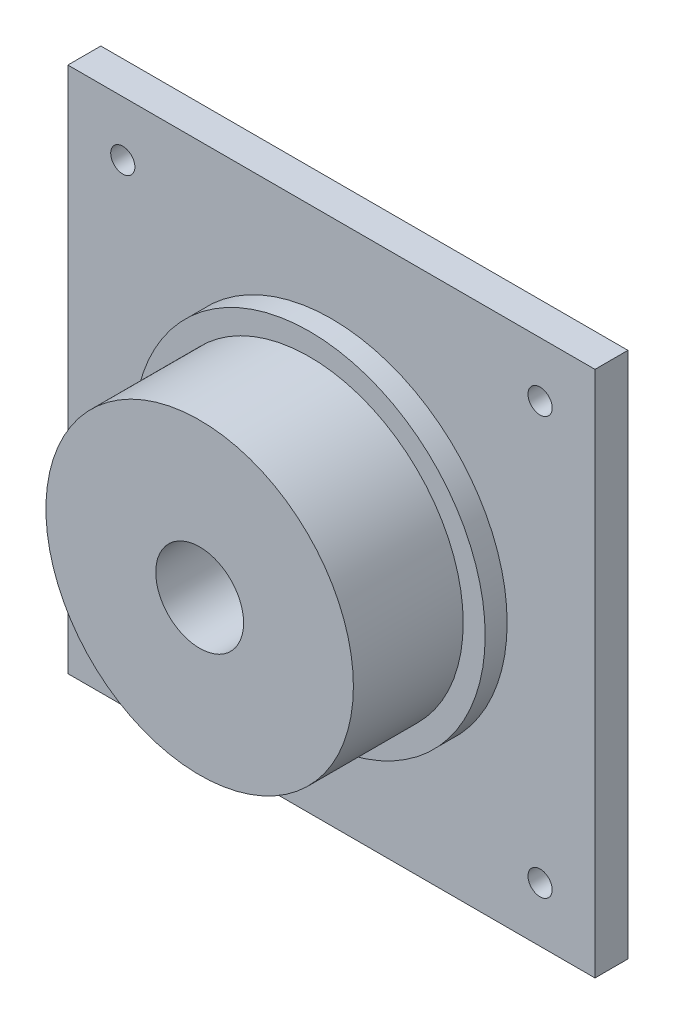
ISO-10303-21;
HEADER;
FILE_DESCRIPTION(('STEP AP214'),'2;1');
FILE_NAME('part.step','',(''),(''),'','','');
FILE_SCHEMA(('AUTOMOTIVE_DESIGN { 1 0 10303 214 1 1 1 1 }'));
ENDSEC;
DATA;
#1=APPLICATION_CONTEXT('core data for automotive mechanical design processes');
#2=APPLICATION_PROTOCOL_DEFINITION('international standard','automotive_design',2000,#1);
#3=PRODUCT_CONTEXT('',#1,'mechanical');
#4=PRODUCT('Part','Part','',(#3));
#5=PRODUCT_RELATED_PRODUCT_CATEGORY('part','',(#4));
#6=PRODUCT_DEFINITION_FORMATION('','',#4);
#7=PRODUCT_DEFINITION_CONTEXT('part definition',#1,'design');
#8=PRODUCT_DEFINITION('design','',#6,#7);
#9=PRODUCT_DEFINITION_SHAPE('','',#8);
#10=(LENGTH_UNIT() NAMED_UNIT(*) SI_UNIT(.MILLI.,.METRE.));
#11=(NAMED_UNIT(*) PLANE_ANGLE_UNIT() SI_UNIT($,.RADIAN.));
#12=(NAMED_UNIT(*) SI_UNIT($,.STERADIAN.) SOLID_ANGLE_UNIT());
#13=UNCERTAINTY_MEASURE_WITH_UNIT(LENGTH_MEASURE(1.E-05),#10,'distance_accuracy_value','');
#14=(GEOMETRIC_REPRESENTATION_CONTEXT(3) GLOBAL_UNCERTAINTY_ASSIGNED_CONTEXT((#13)) GLOBAL_UNIT_ASSIGNED_CONTEXT((#10,
#11,#12)) REPRESENTATION_CONTEXT('',''));
#15=CARTESIAN_POINT('',(0.,0.,0.));
#16=DIRECTION('',(0.,0.,1.));
#17=DIRECTION('',(1.,0.,0.));
#18=AXIS2_PLACEMENT_3D('',#15,#16,#17);
#19=CARTESIAN_POINT('',(0.,0.,15.));
#20=DIRECTION('',(0.,0.,-1.));
#21=DIRECTION('',(-1.,0.,0.));
#22=AXIS2_PLACEMENT_3D('',#19,#20,#21);
#23=PLANE('',#22);
#24=CARTESIAN_POINT('',(0.,0.,15.));
#25=DIRECTION('',(0.,0.,-1.));
#26=DIRECTION('',(-1.,0.,0.));
#27=AXIS2_PLACEMENT_3D('',#24,#25,#26);
#28=CIRCLE('',#27,80.);
#29=CARTESIAN_POINT('',(-80.,0.,15.));
#30=VERTEX_POINT('',#29);
#31=EDGE_CURVE('E11',#30,#30,#28,.F.);
#32=ORIENTED_EDGE('',*,*,#31,.F.);
#33=EDGE_LOOP('',(#32));
#34=FACE_BOUND('',#33,.T.);
#35=CARTESIAN_POINT('',(94.9999999999999,94.9999999999998,15.));
#36=DIRECTION('',(0.,0.,1.));
#37=DIRECTION('',(1.,0.,0.));
#38=AXIS2_PLACEMENT_3D('',#35,#36,#37);
#39=CIRCLE('',#38,5.50000000000012);
#40=CARTESIAN_POINT('',(100.5,94.9999999999998,15.));
#41=VERTEX_POINT('',#40);
#42=EDGE_CURVE('E142',#41,#41,#39,.T.);
#43=ORIENTED_EDGE('',*,*,#42,.F.);
#44=EDGE_LOOP('',(#43));
#45=FACE_BOUND('',#44,.T.);
#46=CARTESIAN_POINT('',(94.9999999999999,-95.,15.));
#47=DIRECTION('',(0.,0.,1.));
#48=DIRECTION('',(1.,0.,0.));
#49=AXIS2_PLACEMENT_3D('',#46,#47,#48);
#50=CIRCLE('',#49,5.50000000000007);
#51=CARTESIAN_POINT('',(100.5,-95.,15.));
#52=VERTEX_POINT('',#51);
#53=EDGE_CURVE('E138',#52,#52,#50,.T.);
#54=ORIENTED_EDGE('',*,*,#53,.F.);
#55=EDGE_LOOP('',(#54));
#56=FACE_BOUND('',#55,.T.);
#57=CARTESIAN_POINT('',(-95.,95.,15.));
#58=DIRECTION('',(0.,0.,1.));
#59=DIRECTION('',(1.,0.,0.));
#60=AXIS2_PLACEMENT_3D('',#57,#58,#59);
#61=CIRCLE('',#60,5.5);
#62=CARTESIAN_POINT('',(-89.5,95.,15.));
#63=VERTEX_POINT('',#62);
#64=EDGE_CURVE('E133',#63,#63,#61,.T.);
#65=ORIENTED_EDGE('',*,*,#64,.F.);
#66=EDGE_LOOP('',(#65));
#67=FACE_BOUND('',#66,.T.);
#68=CARTESIAN_POINT('',(-95.,-95.,15.));
#69=DIRECTION('',(0.,0.,1.));
#70=DIRECTION('',(1.,0.,0.));
#71=AXIS2_PLACEMENT_3D('',#68,#69,#70);
#72=CIRCLE('',#71,5.5);
#73=CARTESIAN_POINT('',(-89.5,-95.,15.));
#74=VERTEX_POINT('',#73);
#75=EDGE_CURVE('E128',#74,#74,#72,.T.);
#76=ORIENTED_EDGE('',*,*,#75,.F.);
#77=EDGE_LOOP('',(#76));
#78=FACE_BOUND('',#77,.T.);
#79=DIRECTION('',(0.,1.,0.));
#80=VECTOR('',#79,1.);
#81=CARTESIAN_POINT('',(120.,-120.,15.));
#82=LINE('',#81,#80);
#83=CARTESIAN_POINT('',(120.,-120.,15.));
#84=VERTEX_POINT('',#83);
#85=CARTESIAN_POINT('',(120.,120.,15.));
#86=VERTEX_POINT('',#85);
#87=EDGE_CURVE('E87',#84,#86,#82,.T.);
#88=ORIENTED_EDGE('',*,*,#87,.T.);
#89=DIRECTION('',(-1.,0.,0.));
#90=VECTOR('',#89,1.);
#91=CARTESIAN_POINT('',(-120.,120.,15.));
#92=LINE('',#91,#90);
#93=CARTESIAN_POINT('',(-120.,120.,15.));
#94=VERTEX_POINT('',#93);
#95=EDGE_CURVE('E83',#86,#94,#92,.T.);
#96=ORIENTED_EDGE('',*,*,#95,.T.);
#97=DIRECTION('',(0.,-1.,0.));
#98=VECTOR('',#97,1.);
#99=CARTESIAN_POINT('',(-120.,-120.,15.));
#100=LINE('',#99,#98);
#101=CARTESIAN_POINT('',(-120.,-120.,15.));
#102=VERTEX_POINT('',#101);
#103=EDGE_CURVE('E85',#94,#102,#100,.T.);
#104=ORIENTED_EDGE('',*,*,#103,.T.);
#105=DIRECTION('',(1.,0.,0.));
#106=VECTOR('',#105,1.);
#107=CARTESIAN_POINT('',(-120.,-120.,15.));
#108=LINE('',#107,#106);
#109=EDGE_CURVE('E52',#102,#84,#108,.T.);
#110=ORIENTED_EDGE('',*,*,#109,.T.);
#111=EDGE_LOOP('',(#88,#96,#104,#110));
#112=FACE_BOUND('',#111,.T.);
#113=ADVANCED_FACE('F33',(#34,#45,#56,#67,#78,#112),#23,.F.);
#114=CARTESIAN_POINT('',(0.,0.,0.));
#115=DIRECTION('',(0.,0.,-1.));
#116=DIRECTION('',(-1.,0.,0.));
#117=AXIS2_PLACEMENT_3D('',#114,#115,#116);
#118=PLANE('',#117);
#119=CARTESIAN_POINT('',(94.9999999999999,94.9999999999998,0.));
#120=DIRECTION('',(0.,0.,1.));
#121=DIRECTION('',(1.,0.,0.));
#122=AXIS2_PLACEMENT_3D('',#119,#120,#121);
#123=CIRCLE('',#122,5.50000000000012);
#124=CARTESIAN_POINT('',(100.5,94.9999999999998,0.));
#125=VERTEX_POINT('',#124);
#126=EDGE_CURVE('E145',#125,#125,#123,.T.);
#127=ORIENTED_EDGE('',*,*,#126,.T.);
#128=EDGE_LOOP('',(#127));
#129=FACE_BOUND('',#128,.T.);
#130=CARTESIAN_POINT('',(-95.,95.,0.));
#131=DIRECTION('',(0.,0.,1.));
#132=DIRECTION('',(1.,0.,0.));
#133=AXIS2_PLACEMENT_3D('',#130,#131,#132);
#134=CIRCLE('',#133,5.5);
#135=CARTESIAN_POINT('',(-89.5,95.,0.));
#136=VERTEX_POINT('',#135);
#137=EDGE_CURVE('E135',#136,#136,#134,.T.);
#138=ORIENTED_EDGE('',*,*,#137,.T.);
#139=EDGE_LOOP('',(#138));
#140=FACE_BOUND('',#139,.T.);
#141=DIRECTION('',(0.,1.,0.));
#142=VECTOR('',#141,1.);
#143=CARTESIAN_POINT('',(120.,-120.,0.));
#144=LINE('',#143,#142);
#145=CARTESIAN_POINT('',(120.,-120.,0.));
#146=VERTEX_POINT('',#145);
#147=CARTESIAN_POINT('',(120.,120.,0.));
#148=VERTEX_POINT('',#147);
#149=EDGE_CURVE('E101',#146,#148,#144,.T.);
#150=ORIENTED_EDGE('',*,*,#149,.F.);
#151=DIRECTION('',(1.,0.,0.));
#152=VECTOR('',#151,1.);
#153=CARTESIAN_POINT('',(-120.,-120.,0.));
#154=LINE('',#153,#152);
#155=CARTESIAN_POINT('',(-120.,-120.,0.));
#156=VERTEX_POINT('',#155);
#157=EDGE_CURVE('E75',#156,#146,#154,.T.);
#158=ORIENTED_EDGE('',*,*,#157,.F.);
#159=DIRECTION('',(0.,-1.,0.));
#160=VECTOR('',#159,1.);
#161=CARTESIAN_POINT('',(-120.,-120.,0.));
#162=LINE('',#161,#160);
#163=CARTESIAN_POINT('',(-120.,120.,0.));
#164=VERTEX_POINT('',#163);
#165=EDGE_CURVE('E69',#164,#156,#162,.T.);
#166=ORIENTED_EDGE('',*,*,#165,.F.);
#167=DIRECTION('',(-1.,0.,0.));
#168=VECTOR('',#167,1.);
#169=CARTESIAN_POINT('',(-120.,120.,0.));
#170=LINE('',#169,#168);
#171=EDGE_CURVE('E92',#148,#164,#170,.T.);
#172=ORIENTED_EDGE('',*,*,#171,.F.);
#173=EDGE_LOOP('',(#150,#158,#166,#172));
#174=FACE_BOUND('',#173,.T.);
#175=CARTESIAN_POINT('',(-95.,-95.,0.));
#176=DIRECTION('',(0.,0.,1.));
#177=DIRECTION('',(1.,0.,0.));
#178=AXIS2_PLACEMENT_3D('',#175,#176,#177);
#179=CIRCLE('',#178,5.5);
#180=CARTESIAN_POINT('',(-89.5,-95.,0.));
#181=VERTEX_POINT('',#180);
#182=EDGE_CURVE('E120',#181,#181,#179,.T.);
#183=ORIENTED_EDGE('',*,*,#182,.T.);
#184=EDGE_LOOP('',(#183));
#185=FACE_BOUND('',#184,.T.);
#186=CARTESIAN_POINT('',(94.9999999999999,-95.,0.));
#187=DIRECTION('',(0.,0.,1.));
#188=DIRECTION('',(1.,0.,0.));
#189=AXIS2_PLACEMENT_3D('',#186,#187,#188);
#190=CIRCLE('',#189,5.50000000000007);
#191=CARTESIAN_POINT('',(100.5,-95.,0.));
#192=VERTEX_POINT('',#191);
#193=EDGE_CURVE('E124',#192,#192,#190,.T.);
#194=ORIENTED_EDGE('',*,*,#193,.T.);
#195=EDGE_LOOP('',(#194));
#196=FACE_BOUND('',#195,.T.);
#197=CARTESIAN_POINT('',(0.,0.,0.));
#198=DIRECTION('',(0.,0.,1.));
#199=DIRECTION('',(1.,0.,0.));
#200=AXIS2_PLACEMENT_3D('',#197,#198,#199);
#201=CIRCLE('',#200,20.);
#202=CARTESIAN_POINT('',(20.,0.,0.));
#203=VERTEX_POINT('',#202);
#204=EDGE_CURVE('E104',#203,#203,#201,.T.);
#205=ORIENTED_EDGE('',*,*,#204,.T.);
#206=EDGE_LOOP('',(#205));
#207=FACE_BOUND('',#206,.T.);
#208=ADVANCED_FACE('F112',(#129,#140,#174,#185,#196,#207),#118,.T.);
#209=CARTESIAN_POINT('',(120.,-120.,15.));
#210=DIRECTION('',(-1.,0.,0.));
#211=DIRECTION('',(0.,0.,1.));
#212=AXIS2_PLACEMENT_3D('',#209,#210,#211);
#213=PLANE('',#212);
#214=ORIENTED_EDGE('',*,*,#149,.T.);
#215=DIRECTION('',(0.,0.,-1.));
#216=VECTOR('',#215,1.);
#217=CARTESIAN_POINT('',(120.,120.,15.));
#218=LINE('',#217,#216);
#219=EDGE_CURVE('E43',#86,#148,#218,.T.);
#220=ORIENTED_EDGE('',*,*,#219,.F.);
#221=ORIENTED_EDGE('',*,*,#87,.F.);
#222=DIRECTION('',(0.,0.,-1.));
#223=VECTOR('',#222,1.);
#224=CARTESIAN_POINT('',(120.,-120.,15.));
#225=LINE('',#224,#223);
#226=EDGE_CURVE('E97',#84,#146,#225,.T.);
#227=ORIENTED_EDGE('',*,*,#226,.T.);
#228=EDGE_LOOP('',(#214,#220,#221,#227));
#229=FACE_BOUND('',#228,.T.);
#230=ADVANCED_FACE('F35',(#229),#213,.F.);
#231=CARTESIAN_POINT('',(-120.,120.,15.));
#232=DIRECTION('',(0.,-1.,0.));
#233=DIRECTION('',(0.,0.,-1.));
#234=AXIS2_PLACEMENT_3D('',#231,#232,#233);
#235=PLANE('',#234);
#236=ORIENTED_EDGE('',*,*,#171,.T.);
#237=DIRECTION('',(0.,0.,-1.));
#238=VECTOR('',#237,1.);
#239=CARTESIAN_POINT('',(-120.,120.,15.));
#240=LINE('',#239,#238);
#241=EDGE_CURVE('E90',#94,#164,#240,.T.);
#242=ORIENTED_EDGE('',*,*,#241,.F.);
#243=ORIENTED_EDGE('',*,*,#95,.F.);
#244=ORIENTED_EDGE('',*,*,#219,.T.);
#245=EDGE_LOOP('',(#236,#242,#243,#244));
#246=FACE_BOUND('',#245,.T.);
#247=ADVANCED_FACE('F91',(#246),#235,.F.);
#248=CARTESIAN_POINT('',(-120.,-120.,15.));
#249=DIRECTION('',(1.,0.,0.));
#250=DIRECTION('',(0.,0.,-1.));
#251=AXIS2_PLACEMENT_3D('',#248,#249,#250);
#252=PLANE('',#251);
#253=ORIENTED_EDGE('',*,*,#165,.T.);
#254=DIRECTION('',(0.,0.,-1.));
#255=VECTOR('',#254,1.);
#256=CARTESIAN_POINT('',(-120.,-120.,15.));
#257=LINE('',#256,#255);
#258=EDGE_CURVE('E93',#102,#156,#257,.T.);
#259=ORIENTED_EDGE('',*,*,#258,.F.);
#260=ORIENTED_EDGE('',*,*,#103,.F.);
#261=ORIENTED_EDGE('',*,*,#241,.T.);
#262=EDGE_LOOP('',(#253,#259,#260,#261));
#263=FACE_BOUND('',#262,.T.);
#264=ADVANCED_FACE('F95',(#263),#252,.F.);
#265=CARTESIAN_POINT('',(-120.,-120.,15.));
#266=DIRECTION('',(0.,1.,0.));
#267=DIRECTION('',(0.,0.,1.));
#268=AXIS2_PLACEMENT_3D('',#265,#266,#267);
#269=PLANE('',#268);
#270=ORIENTED_EDGE('',*,*,#157,.T.);
#271=ORIENTED_EDGE('',*,*,#226,.F.);
#272=ORIENTED_EDGE('',*,*,#109,.F.);
#273=ORIENTED_EDGE('',*,*,#258,.T.);
#274=EDGE_LOOP('',(#270,#271,#272,#273));
#275=FACE_BOUND('',#274,.T.);
#276=ADVANCED_FACE('F187',(#275),#269,.F.);
#277=CARTESIAN_POINT('',(0.,0.,15.));
#278=DIRECTION('',(0.,0.,-1.));
#279=DIRECTION('',(-1.,0.,0.));
#280=AXIS2_PLACEMENT_3D('',#277,#278,#279);
#281=CYLINDRICAL_SURFACE('',#280,20.);
#282=ORIENTED_EDGE('',*,*,#204,.F.);
#283=EDGE_LOOP('',(#282));
#284=FACE_BOUND('',#283,.T.);
#285=CARTESIAN_POINT('',(0.,0.,75.));
#286=DIRECTION('',(0.,0.,1.));
#287=DIRECTION('',(1.,0.,0.));
#288=AXIS2_PLACEMENT_3D('',#285,#286,#287);
#289=CIRCLE('',#288,20.);
#290=CARTESIAN_POINT('',(20.,0.,75.));
#291=VERTEX_POINT('',#290);
#292=EDGE_CURVE('E153',#291,#291,#289,.T.);
#293=ORIENTED_EDGE('',*,*,#292,.T.);
#294=EDGE_LOOP('',(#293));
#295=FACE_BOUND('',#294,.T.);
#296=ADVANCED_FACE('F184',(#284,#295),#281,.F.);
#297=CARTESIAN_POINT('',(-95.,-95.,15.));
#298=DIRECTION('',(0.,0.,-1.));
#299=DIRECTION('',(-1.,0.,0.));
#300=AXIS2_PLACEMENT_3D('',#297,#298,#299);
#301=CYLINDRICAL_SURFACE('',#300,5.5);
#302=ORIENTED_EDGE('',*,*,#75,.T.);
#303=EDGE_LOOP('',(#302));
#304=FACE_BOUND('',#303,.T.);
#305=ORIENTED_EDGE('',*,*,#182,.F.);
#306=EDGE_LOOP('',(#305));
#307=FACE_BOUND('',#306,.T.);
#308=ADVANCED_FACE('F241',(#304,#307),#301,.F.);
#309=CARTESIAN_POINT('',(-95.,95.,15.));
#310=DIRECTION('',(0.,0.,-1.));
#311=DIRECTION('',(-1.,0.,0.));
#312=AXIS2_PLACEMENT_3D('',#309,#310,#311);
#313=CYLINDRICAL_SURFACE('',#312,5.5);
#314=ORIENTED_EDGE('',*,*,#64,.T.);
#315=EDGE_LOOP('',(#314));
#316=FACE_BOUND('',#315,.T.);
#317=ORIENTED_EDGE('',*,*,#137,.F.);
#318=EDGE_LOOP('',(#317));
#319=FACE_BOUND('',#318,.T.);
#320=ADVANCED_FACE('F260',(#316,#319),#313,.F.);
#321=CARTESIAN_POINT('',(94.9999999999999,-95.,15.));
#322=DIRECTION('',(0.,0.,-1.));
#323=DIRECTION('',(-1.,0.,0.));
#324=AXIS2_PLACEMENT_3D('',#321,#322,#323);
#325=CYLINDRICAL_SURFACE('',#324,5.50000000000007);
#326=ORIENTED_EDGE('',*,*,#53,.T.);
#327=EDGE_LOOP('',(#326));
#328=FACE_BOUND('',#327,.T.);
#329=ORIENTED_EDGE('',*,*,#193,.F.);
#330=EDGE_LOOP('',(#329));
#331=FACE_BOUND('',#330,.T.);
#332=ADVANCED_FACE('F250',(#328,#331),#325,.F.);
#333=CARTESIAN_POINT('',(94.9999999999999,94.9999999999998,15.));
#334=DIRECTION('',(0.,0.,-1.));
#335=DIRECTION('',(-1.,0.,0.));
#336=AXIS2_PLACEMENT_3D('',#333,#334,#335);
#337=CYLINDRICAL_SURFACE('',#336,5.50000000000012);
#338=ORIENTED_EDGE('',*,*,#42,.T.);
#339=EDGE_LOOP('',(#338));
#340=FACE_BOUND('',#339,.T.);
#341=ORIENTED_EDGE('',*,*,#126,.F.);
#342=EDGE_LOOP('',(#341));
#343=FACE_BOUND('',#342,.T.);
#344=ADVANCED_FACE('F213',(#340,#343),#337,.F.);
#345=CARTESIAN_POINT('',(0.,0.,75.));
#346=DIRECTION('',(0.,0.,-1.));
#347=DIRECTION('',(-1.,0.,0.));
#348=AXIS2_PLACEMENT_3D('',#345,#346,#347);
#349=CYLINDRICAL_SURFACE('',#348,70.);
#350=CARTESIAN_POINT('',(0.,0.,25.));
#351=DIRECTION('',(0.,0.,1.));
#352=DIRECTION('',(1.,0.,0.));
#353=AXIS2_PLACEMENT_3D('',#350,#351,#352);
#354=CIRCLE('',#353,70.);
#355=CARTESIAN_POINT('',(70.,0.,25.));
#356=VERTEX_POINT('',#355);
#357=EDGE_CURVE('E37',#356,#356,#354,.T.);
#358=ORIENTED_EDGE('',*,*,#357,.T.);
#359=EDGE_LOOP('',(#358));
#360=FACE_BOUND('',#359,.T.);
#361=CARTESIAN_POINT('',(0.,0.,75.));
#362=DIRECTION('',(0.,0.,1.));
#363=DIRECTION('',(1.,0.,0.));
#364=AXIS2_PLACEMENT_3D('',#361,#362,#363);
#365=CIRCLE('',#364,70.);
#366=CARTESIAN_POINT('',(70.,0.,75.));
#367=VERTEX_POINT('',#366);
#368=EDGE_CURVE('E148',#367,#367,#365,.T.);
#369=ORIENTED_EDGE('',*,*,#368,.F.);
#370=EDGE_LOOP('',(#369));
#371=FACE_BOUND('',#370,.T.);
#372=ADVANCED_FACE('F163',(#360,#371),#349,.T.);
#373=CARTESIAN_POINT('',(0.,0.,75.));
#374=DIRECTION('',(0.,0.,1.));
#375=DIRECTION('',(1.,0.,0.));
#376=AXIS2_PLACEMENT_3D('',#373,#374,#375);
#377=PLANE('',#376);
#378=ORIENTED_EDGE('',*,*,#368,.T.);
#379=EDGE_LOOP('',(#378));
#380=FACE_BOUND('',#379,.T.);
#381=ORIENTED_EDGE('',*,*,#292,.F.);
#382=EDGE_LOOP('',(#381));
#383=FACE_BOUND('',#382,.T.);
#384=ADVANCED_FACE('F173',(#380,#383),#377,.T.);
#385=CARTESIAN_POINT('',(0.,0.,25.));
#386=DIRECTION('',(0.,0.,-1.));
#387=DIRECTION('',(-1.,0.,0.));
#388=AXIS2_PLACEMENT_3D('',#385,#386,#387);
#389=CYLINDRICAL_SURFACE('',#388,80.);
#390=CARTESIAN_POINT('',(0.,0.,25.));
#391=DIRECTION('',(0.,0.,1.));
#392=DIRECTION('',(1.,0.,0.));
#393=AXIS2_PLACEMENT_3D('',#390,#391,#392);
#394=CIRCLE('',#393,80.);
#395=CARTESIAN_POINT('',(80.,0.,25.));
#396=VERTEX_POINT('',#395);
#397=EDGE_CURVE('E156',#396,#396,#394,.T.);
#398=ORIENTED_EDGE('',*,*,#397,.F.);
#399=EDGE_LOOP('',(#398));
#400=FACE_BOUND('',#399,.T.);
#401=ORIENTED_EDGE('',*,*,#31,.T.);
#402=EDGE_LOOP('',(#401));
#403=FACE_BOUND('',#402,.T.);
#404=ADVANCED_FACE('F168',(#400,#403),#389,.T.);
#405=CARTESIAN_POINT('',(0.,0.,25.));
#406=DIRECTION('',(0.,0.,1.));
#407=DIRECTION('',(1.,0.,0.));
#408=AXIS2_PLACEMENT_3D('',#405,#406,#407);
#409=PLANE('',#408);
#410=ORIENTED_EDGE('',*,*,#357,.F.);
#411=EDGE_LOOP('',(#410));
#412=FACE_BOUND('',#411,.T.);
#413=ORIENTED_EDGE('',*,*,#397,.T.);
#414=EDGE_LOOP('',(#413));
#415=FACE_BOUND('',#414,.T.);
#416=ADVANCED_FACE('F166',(#412,#415),#409,.T.);
#417=CLOSED_SHELL('',(#113,#208,#230,#247,#264,#276,#296,#308,#320,#332,#344,#372,#384,#404,#416));
#418=MANIFOLD_SOLID_BREP('B2',#417);
#419=ADVANCED_BREP_SHAPE_REPRESENTATION('',(#18,#418),#14);
#420=SHAPE_DEFINITION_REPRESENTATION(#9,#419);
ENDSEC;
END-ISO-10303-21;
